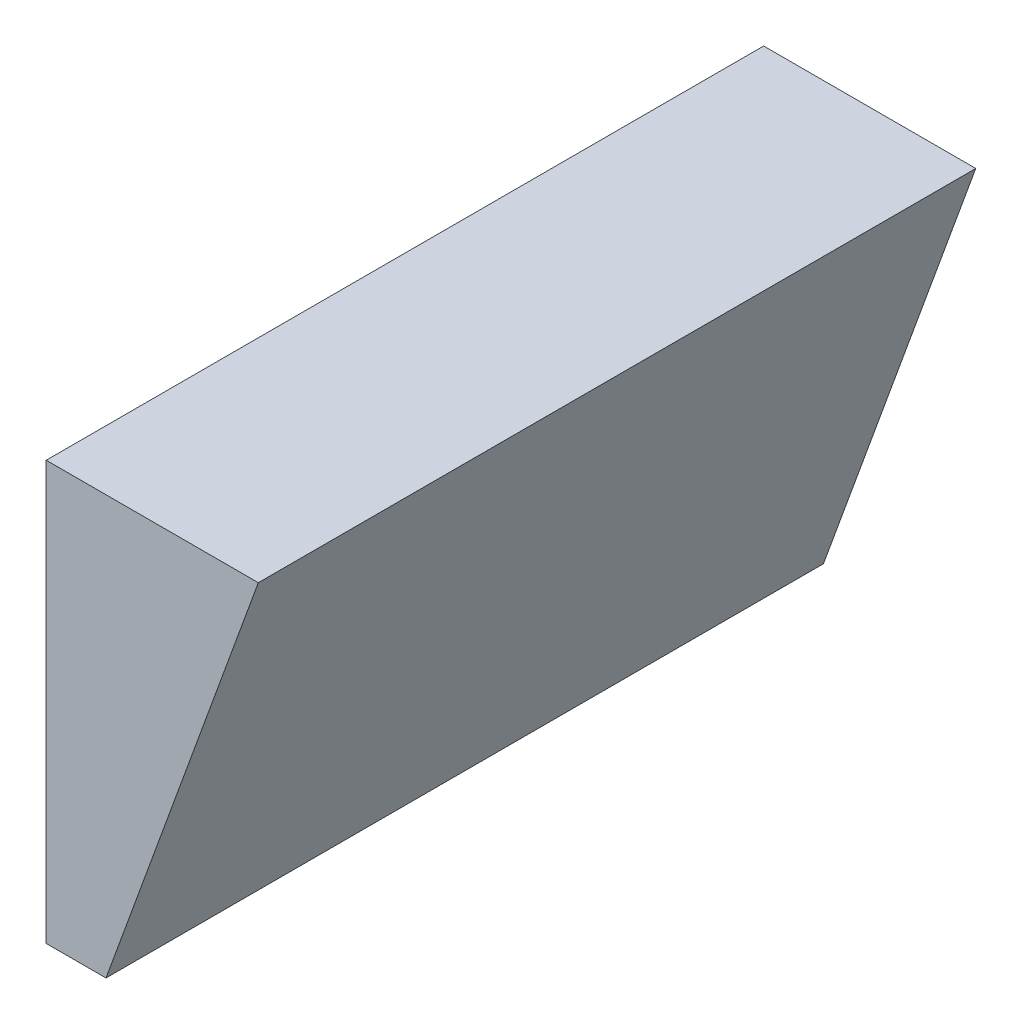
ISO-10303-21;
HEADER;
FILE_DESCRIPTION(('STEP AP214'),'2;1');
FILE_NAME('part.step','',(''),(''),'','','');
FILE_SCHEMA(('AUTOMOTIVE_DESIGN { 1 0 10303 214 1 1 1 1 }'));
ENDSEC;
DATA;
#1=APPLICATION_CONTEXT('core data for automotive mechanical design processes');
#2=APPLICATION_PROTOCOL_DEFINITION('international standard','automotive_design',2000,#1);
#3=PRODUCT_CONTEXT('',#1,'mechanical');
#4=PRODUCT('Part','Part','',(#3));
#5=PRODUCT_RELATED_PRODUCT_CATEGORY('part','',(#4));
#6=PRODUCT_DEFINITION_FORMATION('','',#4);
#7=PRODUCT_DEFINITION_CONTEXT('part definition',#1,'design');
#8=PRODUCT_DEFINITION('design','',#6,#7);
#9=PRODUCT_DEFINITION_SHAPE('','',#8);
#10=(LENGTH_UNIT() NAMED_UNIT(*) SI_UNIT(.MILLI.,.METRE.));
#11=(NAMED_UNIT(*) PLANE_ANGLE_UNIT() SI_UNIT($,.RADIAN.));
#12=(NAMED_UNIT(*) SI_UNIT($,.STERADIAN.) SOLID_ANGLE_UNIT());
#13=UNCERTAINTY_MEASURE_WITH_UNIT(LENGTH_MEASURE(1.E-05),#10,'distance_accuracy_value','');
#14=(GEOMETRIC_REPRESENTATION_CONTEXT(3) GLOBAL_UNCERTAINTY_ASSIGNED_CONTEXT((#13)) GLOBAL_UNIT_ASSIGNED_CONTEXT((#10,
#11,#12)) REPRESENTATION_CONTEXT('',''));
#15=CARTESIAN_POINT('',(0.,0.,0.));
#16=DIRECTION('',(0.,0.,1.));
#17=DIRECTION('',(1.,0.,0.));
#18=AXIS2_PLACEMENT_3D('',#15,#16,#17);
#19=CARTESIAN_POINT('',(0.,0.,60.));
#20=DIRECTION('',(0.,1.,0.));
#21=DIRECTION('',(0.,0.,1.));
#22=AXIS2_PLACEMENT_3D('',#19,#20,#21);
#23=PLANE('',#22);
#24=DIRECTION('',(1.,0.,0.));
#25=VECTOR('',#24,1.);
#26=CARTESIAN_POINT('',(0.,0.,0.));
#27=LINE('',#26,#25);
#28=CARTESIAN_POINT('',(0.,0.,0.));
#29=VERTEX_POINT('',#28);
#30=CARTESIAN_POINT('',(5.,0.,0.));
#31=VERTEX_POINT('',#30);
#32=EDGE_CURVE('E107',#29,#31,#27,.T.);
#33=ORIENTED_EDGE('',*,*,#32,.T.);
#34=DIRECTION('',(0.,0.,-1.));
#35=VECTOR('',#34,1.);
#36=CARTESIAN_POINT('',(5.,0.,60.));
#37=LINE('',#36,#35);
#38=CARTESIAN_POINT('',(5.,0.,60.));
#39=VERTEX_POINT('',#38);
#40=EDGE_CURVE('E11',#39,#31,#37,.T.);
#41=ORIENTED_EDGE('',*,*,#40,.F.);
#42=DIRECTION('',(1.,0.,0.));
#43=VECTOR('',#42,1.);
#44=CARTESIAN_POINT('',(0.,0.,60.));
#45=LINE('',#44,#43);
#46=CARTESIAN_POINT('',(0.,0.,60.));
#47=VERTEX_POINT('',#46);
#48=EDGE_CURVE('E91',#47,#39,#45,.T.);
#49=ORIENTED_EDGE('',*,*,#48,.F.);
#50=DIRECTION('',(0.,0.,-1.));
#51=VECTOR('',#50,1.);
#52=CARTESIAN_POINT('',(0.,0.,60.));
#53=LINE('',#52,#51);
#54=EDGE_CURVE('E103',#47,#29,#53,.T.);
#55=ORIENTED_EDGE('',*,*,#54,.T.);
#56=EDGE_LOOP('',(#33,#41,#49,#55));
#57=FACE_BOUND('',#56,.T.);
#58=ADVANCED_FACE('F39',(#57),#23,.F.);
#59=CARTESIAN_POINT('',(5.,0.,60.));
#60=DIRECTION('',(-0.939692620785908,0.342020143325669,0.));
#61=DIRECTION('',(-0.342020143325669,-0.939692620785908,0.));
#62=AXIS2_PLACEMENT_3D('',#59,#60,#61);
#63=PLANE('',#62);
#64=DIRECTION('',(0.342020143325669,0.939692620785908,0.));
#65=VECTOR('',#64,1.);
#66=CARTESIAN_POINT('',(5.,0.,0.));
#67=LINE('',#66,#65);
#68=CARTESIAN_POINT('',(17.7389581993171,35.,0.));
#69=VERTEX_POINT('',#68);
#70=EDGE_CURVE('E96',#31,#69,#67,.T.);
#71=ORIENTED_EDGE('',*,*,#70,.T.);
#72=DIRECTION('',(0.,0.,-1.));
#73=VECTOR('',#72,1.);
#74=CARTESIAN_POINT('',(17.7389581993171,35.,60.));
#75=LINE('',#74,#73);
#76=CARTESIAN_POINT('',(17.7389581993171,35.,60.));
#77=VERTEX_POINT('',#76);
#78=EDGE_CURVE('E48',#77,#69,#75,.T.);
#79=ORIENTED_EDGE('',*,*,#78,.F.);
#80=DIRECTION('',(0.342020143325669,0.939692620785908,0.));
#81=VECTOR('',#80,1.);
#82=CARTESIAN_POINT('',(5.,0.,60.));
#83=LINE('',#82,#81);
#84=EDGE_CURVE('E86',#39,#77,#83,.T.);
#85=ORIENTED_EDGE('',*,*,#84,.F.);
#86=ORIENTED_EDGE('',*,*,#40,.T.);
#87=EDGE_LOOP('',(#71,#79,#85,#86));
#88=FACE_BOUND('',#87,.T.);
#89=ADVANCED_FACE('F95',(#88),#63,.F.);
#90=CARTESIAN_POINT('',(17.7389581993171,35.,60.));
#91=DIRECTION('',(0.,-1.,0.));
#92=DIRECTION('',(0.,0.,-1.));
#93=AXIS2_PLACEMENT_3D('',#90,#91,#92);
#94=PLANE('',#93);
#95=DIRECTION('',(-1.,0.,0.));
#96=VECTOR('',#95,1.);
#97=CARTESIAN_POINT('',(17.7389581993171,35.,0.));
#98=LINE('',#97,#96);
#99=CARTESIAN_POINT('',(0.,35.,0.));
#100=VERTEX_POINT('',#99);
#101=EDGE_CURVE('E73',#69,#100,#98,.T.);
#102=ORIENTED_EDGE('',*,*,#101,.T.);
#103=DIRECTION('',(0.,0.,-1.));
#104=VECTOR('',#103,1.);
#105=CARTESIAN_POINT('',(0.,35.,60.));
#106=LINE('',#105,#104);
#107=CARTESIAN_POINT('',(0.,35.,60.));
#108=VERTEX_POINT('',#107);
#109=EDGE_CURVE('E98',#108,#100,#106,.T.);
#110=ORIENTED_EDGE('',*,*,#109,.F.);
#111=DIRECTION('',(-1.,0.,0.));
#112=VECTOR('',#111,1.);
#113=CARTESIAN_POINT('',(17.7389581993171,35.,60.));
#114=LINE('',#113,#112);
#115=EDGE_CURVE('E89',#77,#108,#114,.T.);
#116=ORIENTED_EDGE('',*,*,#115,.F.);
#117=ORIENTED_EDGE('',*,*,#78,.T.);
#118=EDGE_LOOP('',(#102,#110,#116,#117));
#119=FACE_BOUND('',#118,.T.);
#120=ADVANCED_FACE('F99',(#119),#94,.F.);
#121=CARTESIAN_POINT('',(0.,0.,60.));
#122=DIRECTION('',(1.,0.,0.));
#123=DIRECTION('',(0.,0.,-1.));
#124=AXIS2_PLACEMENT_3D('',#121,#122,#123);
#125=PLANE('',#124);
#126=DIRECTION('',(0.,-1.,0.));
#127=VECTOR('',#126,1.);
#128=CARTESIAN_POINT('',(0.,0.,0.));
#129=LINE('',#128,#127);
#130=EDGE_CURVE('E79',#100,#29,#129,.T.);
#131=ORIENTED_EDGE('',*,*,#130,.T.);
#132=ORIENTED_EDGE('',*,*,#54,.F.);
#133=DIRECTION('',(0.,-1.,0.));
#134=VECTOR('',#133,1.);
#135=CARTESIAN_POINT('',(0.,0.,60.));
#136=LINE('',#135,#134);
#137=EDGE_CURVE('E56',#108,#47,#136,.T.);
#138=ORIENTED_EDGE('',*,*,#137,.F.);
#139=ORIENTED_EDGE('',*,*,#109,.T.);
#140=EDGE_LOOP('',(#131,#132,#138,#139));
#141=FACE_BOUND('',#140,.T.);
#142=ADVANCED_FACE('F120',(#141),#125,.F.);
#143=CARTESIAN_POINT('',(0.,0.,60.));
#144=DIRECTION('',(0.,0.,1.));
#145=DIRECTION('',(1.,0.,0.));
#146=AXIS2_PLACEMENT_3D('',#143,#144,#145);
#147=PLANE('',#146);
#148=ORIENTED_EDGE('',*,*,#48,.T.);
#149=ORIENTED_EDGE('',*,*,#84,.T.);
#150=ORIENTED_EDGE('',*,*,#115,.T.);
#151=ORIENTED_EDGE('',*,*,#137,.T.);
#152=EDGE_LOOP('',(#148,#149,#150,#151));
#153=FACE_BOUND('',#152,.T.);
#154=ADVANCED_FACE('F87',(#153),#147,.T.);
#155=CARTESIAN_POINT('',(0.,0.,0.));
#156=DIRECTION('',(0.,0.,1.));
#157=DIRECTION('',(1.,0.,0.));
#158=AXIS2_PLACEMENT_3D('',#155,#156,#157);
#159=PLANE('',#158);
#160=ORIENTED_EDGE('',*,*,#32,.F.);
#161=ORIENTED_EDGE('',*,*,#130,.F.);
#162=ORIENTED_EDGE('',*,*,#101,.F.);
#163=ORIENTED_EDGE('',*,*,#70,.F.);
#164=EDGE_LOOP('',(#160,#161,#162,#163));
#165=FACE_BOUND('',#164,.T.);
#166=ADVANCED_FACE('F123',(#165),#159,.F.);
#167=CLOSED_SHELL('',(#58,#89,#120,#142,#154,#166));
#168=MANIFOLD_SOLID_BREP('B2',#167);
#169=ADVANCED_BREP_SHAPE_REPRESENTATION('',(#18,#168),#14);
#170=SHAPE_DEFINITION_REPRESENTATION(#9,#169);
ENDSEC;
END-ISO-10303-21;
